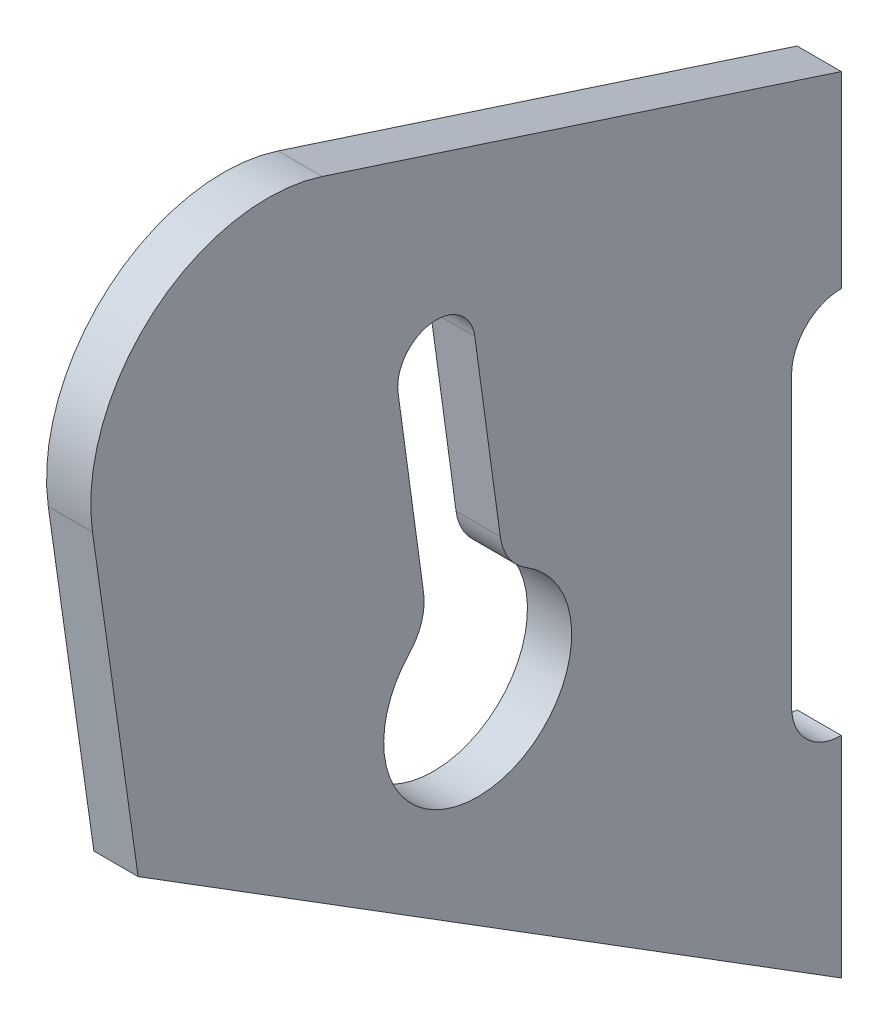
ISO-10303-21;
HEADER;
FILE_DESCRIPTION(('STEP AP214'),'2;1');
FILE_NAME('part.step','',(''),(''),'','','');
FILE_SCHEMA(('AUTOMOTIVE_DESIGN { 1 0 10303 214 1 1 1 1 }'));
ENDSEC;
DATA;
#1=APPLICATION_CONTEXT('core data for automotive mechanical design processes');
#2=APPLICATION_PROTOCOL_DEFINITION('international standard','automotive_design',2000,#1);
#3=PRODUCT_CONTEXT('',#1,'mechanical');
#4=PRODUCT('Part','Part','',(#3));
#5=PRODUCT_RELATED_PRODUCT_CATEGORY('part','',(#4));
#6=PRODUCT_DEFINITION_FORMATION('','',#4);
#7=PRODUCT_DEFINITION_CONTEXT('part definition',#1,'design');
#8=PRODUCT_DEFINITION('design','',#6,#7);
#9=PRODUCT_DEFINITION_SHAPE('','',#8);
#10=(LENGTH_UNIT() NAMED_UNIT(*) SI_UNIT(.MILLI.,.METRE.));
#11=(NAMED_UNIT(*) PLANE_ANGLE_UNIT() SI_UNIT($,.RADIAN.));
#12=(NAMED_UNIT(*) SI_UNIT($,.STERADIAN.) SOLID_ANGLE_UNIT());
#13=UNCERTAINTY_MEASURE_WITH_UNIT(LENGTH_MEASURE(1.E-05),#10,'distance_accuracy_value','');
#14=(GEOMETRIC_REPRESENTATION_CONTEXT(3) GLOBAL_UNCERTAINTY_ASSIGNED_CONTEXT((#13)) GLOBAL_UNIT_ASSIGNED_CONTEXT((#10,
#11,#12)) REPRESENTATION_CONTEXT('',''));
#15=CARTESIAN_POINT('',(0.,0.,0.));
#16=DIRECTION('',(0.,0.,1.));
#17=DIRECTION('',(1.,0.,0.));
#18=AXIS2_PLACEMENT_3D('',#15,#16,#17);
#19=CARTESIAN_POINT('',(4.,99.,0.));
#20=DIRECTION('',(-1.,0.,0.));
#21=DIRECTION('',(0.,0.,1.));
#22=AXIS2_PLACEMENT_3D('',#19,#20,#21);
#23=CYLINDRICAL_SURFACE('',#22,9.);
#24=CARTESIAN_POINT('',(-4.,99.,0.));
#25=DIRECTION('',(1.,0.,0.));
#26=DIRECTION('',(0.,0.,-1.));
#27=AXIS2_PLACEMENT_3D('',#24,#25,#26);
#28=CIRCLE('',#27,9.);
#29=CARTESIAN_POINT('',(-4.,108.,0.));
#30=VERTEX_POINT('',#29);
#31=CARTESIAN_POINT('',(-4.,99.,9.));
#32=VERTEX_POINT('',#31);
#33=EDGE_CURVE('E228',#30,#32,#28,.T.);
#34=ORIENTED_EDGE('',*,*,#33,.F.);
#35=DIRECTION('',(-1.,0.,0.));
#36=VECTOR('',#35,1.);
#37=CARTESIAN_POINT('',(4.,108.,0.));
#38=LINE('',#37,#36);
#39=CARTESIAN_POINT('',(4.,108.,0.));
#40=VERTEX_POINT('',#39);
#41=EDGE_CURVE('E282',#40,#30,#38,.T.);
#42=ORIENTED_EDGE('',*,*,#41,.F.);
#43=CARTESIAN_POINT('',(4.,99.,0.));
#44=DIRECTION('',(1.,0.,0.));
#45=DIRECTION('',(0.,0.,-1.));
#46=AXIS2_PLACEMENT_3D('',#43,#44,#45);
#47=CIRCLE('',#46,9.);
#48=CARTESIAN_POINT('',(4.,99.,9.));
#49=VERTEX_POINT('',#48);
#50=EDGE_CURVE('E190',#40,#49,#47,.T.);
#51=ORIENTED_EDGE('',*,*,#50,.T.);
#52=DIRECTION('',(-1.,0.,0.));
#53=VECTOR('',#52,1.);
#54=CARTESIAN_POINT('',(4.,99.,9.));
#55=LINE('',#54,#53);
#56=EDGE_CURVE('E170',#49,#32,#55,.T.);
#57=ORIENTED_EDGE('',*,*,#56,.T.);
#58=EDGE_LOOP('',(#34,#42,#51,#57));
#59=FACE_BOUND('',#58,.T.);
#60=ADVANCED_FACE('F42',(#59),#23,.F.);
#61=CARTESIAN_POINT('',(4.,0.,0.));
#62=DIRECTION('',(0.,0.,1.));
#63=DIRECTION('',(1.,0.,0.));
#64=AXIS2_PLACEMENT_3D('',#61,#62,#63);
#65=PLANE('',#64);
#66=DIRECTION('',(0.,1.,0.));
#67=VECTOR('',#66,1.);
#68=CARTESIAN_POINT('',(-4.,0.,0.));
#69=LINE('',#68,#67);
#70=CARTESIAN_POINT('',(-4.,142.,0.));
#71=VERTEX_POINT('',#70);
#72=EDGE_CURVE('E234',#30,#71,#69,.T.);
#73=ORIENTED_EDGE('',*,*,#72,.T.);
#74=DIRECTION('',(-1.,0.,0.));
#75=VECTOR('',#74,1.);
#76=CARTESIAN_POINT('',(4.,142.,0.));
#77=LINE('',#76,#75);
#78=CARTESIAN_POINT('',(4.,142.,0.));
#79=VERTEX_POINT('',#78);
#80=EDGE_CURVE('E279',#79,#71,#77,.T.);
#81=ORIENTED_EDGE('',*,*,#80,.F.);
#82=DIRECTION('',(0.,1.,0.));
#83=VECTOR('',#82,1.);
#84=CARTESIAN_POINT('',(4.,0.,0.));
#85=LINE('',#84,#83);
#86=EDGE_CURVE('E193',#40,#79,#85,.T.);
#87=ORIENTED_EDGE('',*,*,#86,.F.);
#88=ORIENTED_EDGE('',*,*,#41,.T.);
#89=EDGE_LOOP('',(#73,#81,#87,#88));
#90=FACE_BOUND('',#89,.T.);
#91=ADVANCED_FACE('F326',(#90),#65,.F.);
#92=CARTESIAN_POINT('',(4.,128.440206600621,-41.7327529127661));
#93=DIRECTION('',(0.,0.951056516295152,-0.309016994374952));
#94=DIRECTION('',(0.,0.309016994374952,0.951056516295152));
#95=AXIS2_PLACEMENT_3D('',#92,#93,#94);
#96=PLANE('',#95);
#97=DIRECTION('',(0.,-0.309016994374951,-0.951056516295152));
#98=VECTOR('',#97,1.);
#99=CARTESIAN_POINT('',(-4.,128.440206600621,-41.7327529127661));
#100=LINE('',#99,#98);
#101=CARTESIAN_POINT('',(-4.,172.503548140476,93.8802679373735));
#102=VERTEX_POINT('',#101);
#103=EDGE_CURVE('E236',#102,#71,#100,.T.);
#104=ORIENTED_EDGE('',*,*,#103,.F.);
#105=DIRECTION('',(-1.,0.,0.));
#106=VECTOR('',#105,1.);
#107=CARTESIAN_POINT('',(4.,172.503548140476,93.8802679373735));
#108=LINE('',#107,#106);
#109=CARTESIAN_POINT('',(4.,172.503548140476,93.8802679373735));
#110=VERTEX_POINT('',#109);
#111=EDGE_CURVE('E274',#110,#102,#108,.T.);
#112=ORIENTED_EDGE('',*,*,#111,.F.);
#113=DIRECTION('',(0.,-0.309016994374951,-0.951056516295152));
#114=VECTOR('',#113,1.);
#115=CARTESIAN_POINT('',(4.,128.440206600621,-41.7327529127661));
#116=LINE('',#115,#114);
#117=EDGE_CURVE('E194',#110,#79,#116,.T.);
#118=ORIENTED_EDGE('',*,*,#117,.T.);
#119=ORIENTED_EDGE('',*,*,#80,.T.);
#120=EDGE_LOOP('',(#104,#112,#118,#119));
#121=FACE_BOUND('',#120,.T.);
#122=ADVANCED_FACE('F335',(#121),#96,.T.);
#123=CARTESIAN_POINT('',(4.,142.069739619031,103.768811757372));
#124=DIRECTION('',(-1.,0.,0.));
#125=DIRECTION('',(0.,0.,1.));
#126=AXIS2_PLACEMENT_3D('',#123,#124,#125);
#127=CYLINDRICAL_SURFACE('',#126,32.);
#128=CARTESIAN_POINT('',(-4.,142.069739619031,103.768811757372));
#129=DIRECTION('',(1.,0.,0.));
#130=DIRECTION('',(0.,0.,-1.));
#131=AXIS2_PLACEMENT_3D('',#128,#129,#130);
#132=CIRCLE('',#131,32.);
#133=CARTESIAN_POINT('',(-4.,137.573015723535,135.451290735629));
#134=VERTEX_POINT('',#133);
#135=EDGE_CURVE('E244',#134,#102,#132,.F.);
#136=ORIENTED_EDGE('',*,*,#135,.F.);
#137=DIRECTION('',(-1.,0.,0.));
#138=VECTOR('',#137,1.);
#139=CARTESIAN_POINT('',(4.,137.573015723535,135.451290735629));
#140=LINE('',#139,#138);
#141=CARTESIAN_POINT('',(4.,137.573015723535,135.451290735629));
#142=VERTEX_POINT('',#141);
#143=EDGE_CURVE('E275',#142,#134,#140,.T.);
#144=ORIENTED_EDGE('',*,*,#143,.F.);
#145=CARTESIAN_POINT('',(4.,142.069739619031,103.768811757372));
#146=DIRECTION('',(1.,0.,0.));
#147=DIRECTION('',(0.,0.,-1.));
#148=AXIS2_PLACEMENT_3D('',#145,#146,#147);
#149=CIRCLE('',#148,32.);
#150=EDGE_CURVE('E200',#142,#110,#149,.F.);
#151=ORIENTED_EDGE('',*,*,#150,.T.);
#152=ORIENTED_EDGE('',*,*,#111,.T.);
#153=EDGE_LOOP('',(#136,#144,#151,#152));
#154=FACE_BOUND('',#153,.T.);
#155=ADVANCED_FACE('F369',(#154),#127,.T.);
#156=CARTESIAN_POINT('',(4.,-16.1285050060768,113.636290037191));
#157=DIRECTION('',(0.,-0.140522621734246,0.990077468070521));
#158=DIRECTION('',(0.,-0.990077468070521,-0.140522621734246));
#159=AXIS2_PLACEMENT_3D('',#156,#157,#158);
#160=PLANE('',#159);
#161=DIRECTION('',(0.,0.990077468070521,0.140522621734246));
#162=VECTOR('',#161,1.);
#163=CARTESIAN_POINT('',(-4.,-16.1285050060768,113.636290037191));
#164=LINE('',#163,#162);
#165=CARTESIAN_POINT('',(-4.,79.4878896349804,127.207214423464));
#166=VERTEX_POINT('',#165);
#167=EDGE_CURVE('E250',#166,#134,#164,.T.);
#168=ORIENTED_EDGE('',*,*,#167,.F.);
#169=DIRECTION('',(-1.,0.,0.));
#170=VECTOR('',#169,1.);
#171=CARTESIAN_POINT('',(4.,79.4878896349804,127.207214423464));
#172=LINE('',#171,#170);
#173=CARTESIAN_POINT('',(4.,79.4878896349804,127.207214423464));
#174=VERTEX_POINT('',#173);
#175=EDGE_CURVE('E267',#174,#166,#172,.T.);
#176=ORIENTED_EDGE('',*,*,#175,.F.);
#177=DIRECTION('',(0.,0.990077468070521,0.140522621734246));
#178=VECTOR('',#177,1.);
#179=CARTESIAN_POINT('',(4.,-16.1285050060768,113.636290037191));
#180=LINE('',#179,#178);
#181=EDGE_CURVE('E201',#174,#142,#180,.T.);
#182=ORIENTED_EDGE('',*,*,#181,.T.);
#183=ORIENTED_EDGE('',*,*,#143,.T.);
#184=EDGE_LOOP('',(#168,#176,#182,#183));
#185=FACE_BOUND('',#184,.T.);
#186=ADVANCED_FACE('F368',(#185),#160,.T.);
#187=CARTESIAN_POINT('',(4.,0.,0.));
#188=DIRECTION('',(0.,-0.848048096156428,0.529919264233202));
#189=DIRECTION('',(0.,-0.529919264233202,-0.848048096156428));
#190=AXIS2_PLACEMENT_3D('',#187,#188,#189);
#191=PLANE('',#190);
#192=DIRECTION('',(0.,0.529919264233202,0.848048096156428));
#193=VECTOR('',#192,1.);
#194=CARTESIAN_POINT('',(-4.,0.,0.));
#195=LINE('',#194,#193);
#196=CARTESIAN_POINT('',(-4.,0.,0.));
#197=VERTEX_POINT('',#196);
#198=EDGE_CURVE('E253',#197,#166,#195,.T.);
#199=ORIENTED_EDGE('',*,*,#198,.F.);
#200=DIRECTION('',(-1.,0.,0.));
#201=VECTOR('',#200,1.);
#202=CARTESIAN_POINT('',(4.,0.,0.));
#203=LINE('',#202,#201);
#204=CARTESIAN_POINT('',(4.,0.,0.));
#205=VERTEX_POINT('',#204);
#206=EDGE_CURVE('E266',#205,#197,#203,.T.);
#207=ORIENTED_EDGE('',*,*,#206,.F.);
#208=DIRECTION('',(0.,0.529919264233202,0.848048096156428));
#209=VECTOR('',#208,1.);
#210=CARTESIAN_POINT('',(4.,0.,0.));
#211=LINE('',#210,#209);
#212=EDGE_CURVE('E210',#205,#174,#211,.T.);
#213=ORIENTED_EDGE('',*,*,#212,.T.);
#214=ORIENTED_EDGE('',*,*,#175,.T.);
#215=EDGE_LOOP('',(#199,#207,#213,#214));
#216=FACE_BOUND('',#215,.T.);
#217=ADVANCED_FACE('F356',(#216),#191,.T.);
#218=CARTESIAN_POINT('',(-4.,38.,0.));
#219=VERTEX_POINT('',#218);
#220=EDGE_CURVE('E239',#197,#219,#69,.T.);
#221=ORIENTED_EDGE('',*,*,#220,.T.);
#222=DIRECTION('',(-1.,0.,0.));
#223=VECTOR('',#222,1.);
#224=CARTESIAN_POINT('',(4.,38.,0.));
#225=LINE('',#224,#223);
#226=CARTESIAN_POINT('',(4.,38.,0.));
#227=VERTEX_POINT('',#226);
#228=EDGE_CURVE('E263',#227,#219,#225,.T.);
#229=ORIENTED_EDGE('',*,*,#228,.F.);
#230=EDGE_CURVE('E192',#205,#227,#85,.T.);
#231=ORIENTED_EDGE('',*,*,#230,.F.);
#232=ORIENTED_EDGE('',*,*,#206,.T.);
#233=EDGE_LOOP('',(#221,#229,#231,#232));
#234=FACE_BOUND('',#233,.T.);
#235=ADVANCED_FACE('F333',(#234),#65,.F.);
#236=CARTESIAN_POINT('',(4.,47.,0.));
#237=DIRECTION('',(-1.,0.,0.));
#238=DIRECTION('',(0.,0.,1.));
#239=AXIS2_PLACEMENT_3D('',#236,#237,#238);
#240=CYLINDRICAL_SURFACE('',#239,9.);
#241=CARTESIAN_POINT('',(-4.,47.,0.));
#242=DIRECTION('',(1.,0.,0.));
#243=DIRECTION('',(0.,0.,-1.));
#244=AXIS2_PLACEMENT_3D('',#241,#242,#243);
#245=CIRCLE('',#244,9.);
#246=CARTESIAN_POINT('',(-4.,47.,9.));
#247=VERTEX_POINT('',#246);
#248=EDGE_CURVE('E177',#247,#219,#245,.T.);
#249=ORIENTED_EDGE('',*,*,#248,.F.);
#250=DIRECTION('',(-1.,0.,0.));
#251=VECTOR('',#250,1.);
#252=CARTESIAN_POINT('',(4.,47.,9.));
#253=LINE('',#252,#251);
#254=CARTESIAN_POINT('',(4.,47.,9.));
#255=VERTEX_POINT('',#254);
#256=EDGE_CURVE('E257',#255,#247,#253,.T.);
#257=ORIENTED_EDGE('',*,*,#256,.F.);
#258=CARTESIAN_POINT('',(4.,47.,0.));
#259=DIRECTION('',(1.,0.,0.));
#260=DIRECTION('',(0.,0.,-1.));
#261=AXIS2_PLACEMENT_3D('',#258,#259,#260);
#262=CIRCLE('',#261,9.);
#263=EDGE_CURVE('E211',#255,#227,#262,.T.);
#264=ORIENTED_EDGE('',*,*,#263,.T.);
#265=ORIENTED_EDGE('',*,*,#228,.T.);
#266=EDGE_LOOP('',(#249,#257,#264,#265));
#267=FACE_BOUND('',#266,.T.);
#268=ADVANCED_FACE('F346',(#267),#240,.F.);
#269=CARTESIAN_POINT('',(4.,132.7354236822,73.2447574240369));
#270=DIRECTION('',(-1.,0.,0.));
#271=DIRECTION('',(0.,0.,1.));
#272=AXIS2_PLACEMENT_3D('',#269,#270,#271);
#273=CYLINDRICAL_SURFACE('',#272,7.00000000000002);
#274=CARTESIAN_POINT('',(-4.,132.7354236822,73.2447574240369));
#275=DIRECTION('',(1.,0.,0.));
#276=DIRECTION('',(0.,0.,-1.));
#277=AXIS2_PLACEMENT_3D('',#274,#275,#276);
#278=CIRCLE('',#277,7.00000000000002);
#279=CARTESIAN_POINT('',(-4.,133.685771579893,66.3095689714171));
#280=VERTEX_POINT('',#279);
#281=CARTESIAN_POINT('',(-4.,131.785075784507,80.1799458766567));
#282=VERTEX_POINT('',#281);
#283=EDGE_CURVE('E164',#280,#282,#278,.T.);
#284=ORIENTED_EDGE('',*,*,#283,.F.);
#285=DIRECTION('',(-1.,0.,0.));
#286=VECTOR('',#285,1.);
#287=CARTESIAN_POINT('',(4.,133.685771579893,66.3095689714171));
#288=LINE('',#287,#286);
#289=CARTESIAN_POINT('',(4.,133.685771579893,66.3095689714171));
#290=VERTEX_POINT('',#289);
#291=EDGE_CURVE('E153',#290,#280,#288,.T.);
#292=ORIENTED_EDGE('',*,*,#291,.F.);
#293=CARTESIAN_POINT('',(4.,132.7354236822,73.2447574240369));
#294=DIRECTION('',(1.,0.,0.));
#295=DIRECTION('',(0.,0.,-1.));
#296=AXIS2_PLACEMENT_3D('',#293,#294,#295);
#297=CIRCLE('',#296,7.00000000000002);
#298=CARTESIAN_POINT('',(4.,131.785075784507,80.1799458766567));
#299=VERTEX_POINT('',#298);
#300=EDGE_CURVE('E158',#290,#299,#297,.T.);
#301=ORIENTED_EDGE('',*,*,#300,.T.);
#302=DIRECTION('',(-1.,0.,0.));
#303=VECTOR('',#302,1.);
#304=CARTESIAN_POINT('',(4.,131.785075784507,80.1799458766567));
#305=LINE('',#304,#303);
#306=EDGE_CURVE('E169',#299,#282,#305,.T.);
#307=ORIENTED_EDGE('',*,*,#306,.T.);
#308=EDGE_LOOP('',(#284,#292,#301,#307));
#309=FACE_BOUND('',#308,.T.);
#310=ADVANCED_FACE('F165',(#309),#273,.F.);
#311=CARTESIAN_POINT('',(4.,-6.45502213446092,47.1056915862058));
#312=DIRECTION('',(0.,-0.135763985384693,0.990741207517112));
#313=DIRECTION('',(0.,-0.990741207517112,-0.135763985384693));
#314=AXIS2_PLACEMENT_3D('',#311,#312,#313);
#315=PLANE('',#314);
#316=DIRECTION('',(0.,0.990741207517112,0.135763985384693));
#317=VECTOR('',#316,1.);
#318=CARTESIAN_POINT('',(-4.,-6.45502213446092,47.1056915862058));
#319=LINE('',#318,#317);
#320=CARTESIAN_POINT('',(-4.,99.9769680602663,61.6903591579452));
#321=VERTEX_POINT('',#320);
#322=EDGE_CURVE('E219',#321,#280,#319,.T.);
#323=ORIENTED_EDGE('',*,*,#322,.F.);
#324=DIRECTION('',(-1.,0.,0.));
#325=VECTOR('',#324,1.);
#326=CARTESIAN_POINT('',(4.,99.9769680602663,61.6903591579452));
#327=LINE('',#326,#325);
#328=CARTESIAN_POINT('',(4.,99.9769680602663,61.6903591579452));
#329=VERTEX_POINT('',#328);
#330=EDGE_CURVE('E11',#321,#329,#327,.F.);
#331=ORIENTED_EDGE('',*,*,#330,.T.);
#332=DIRECTION('',(0.,0.990741207517112,0.135763985384693));
#333=VECTOR('',#332,1.);
#334=CARTESIAN_POINT('',(4.,-6.45502213446092,47.1056915862058));
#335=LINE('',#334,#333);
#336=EDGE_CURVE('E147',#329,#290,#335,.T.);
#337=ORIENTED_EDGE('',*,*,#336,.T.);
#338=ORIENTED_EDGE('',*,*,#291,.T.);
#339=EDGE_LOOP('',(#323,#331,#337,#338));
#340=FACE_BOUND('',#339,.T.);
#341=ADVANCED_FACE('F155',(#340),#315,.T.);
#342=CARTESIAN_POINT('',(4.,78.244657268759,65.7777382278788));
#343=DIRECTION('',(-1.,0.,0.));
#344=DIRECTION('',(0.,0.,1.));
#345=AXIS2_PLACEMENT_3D('',#342,#343,#344);
#346=CYLINDRICAL_SURFACE('',#345,17.);
#347=CARTESIAN_POINT('',(-4.,78.244657268759,65.7777382278788));
#348=DIRECTION('',(1.,0.,0.));
#349=DIRECTION('',(0.,0.,-1.));
#350=AXIS2_PLACEMENT_3D('',#347,#348,#349);
#351=CIRCLE('',#350,17.);
#352=CARTESIAN_POINT('',(-4.,89.8764193953764,78.175403727068));
#353=VERTEX_POINT('',#352);
#354=CARTESIAN_POINT('',(-4.,92.7827743417598,56.9662030624424));
#355=VERTEX_POINT('',#354);
#356=EDGE_CURVE('E224',#353,#355,#351,.T.);
#357=ORIENTED_EDGE('',*,*,#356,.F.);
#358=DIRECTION('',(-1.,0.,0.));
#359=VECTOR('',#358,1.);
#360=CARTESIAN_POINT('',(4.,89.8764193953764,78.175403727068));
#361=LINE('',#360,#359);
#362=CARTESIAN_POINT('',(4.,89.8764193953764,78.175403727068));
#363=VERTEX_POINT('',#362);
#364=EDGE_CURVE('E298',#353,#363,#361,.F.);
#365=ORIENTED_EDGE('',*,*,#364,.T.);
#366=CARTESIAN_POINT('',(4.,78.244657268759,65.7777382278788));
#367=DIRECTION('',(1.,0.,0.));
#368=DIRECTION('',(0.,0.,-1.));
#369=AXIS2_PLACEMENT_3D('',#366,#367,#368);
#370=CIRCLE('',#369,17.);
#371=CARTESIAN_POINT('',(4.,92.7827743417598,56.9662030624424));
#372=VERTEX_POINT('',#371);
#373=EDGE_CURVE('E160',#363,#372,#370,.T.);
#374=ORIENTED_EDGE('',*,*,#373,.T.);
#375=DIRECTION('',(-1.,0.,0.));
#376=VECTOR('',#375,1.);
#377=CARTESIAN_POINT('',(4.,92.7827743417598,56.9662030624424));
#378=LINE('',#377,#376);
#379=EDGE_CURVE('E297',#372,#355,#378,.T.);
#380=ORIENTED_EDGE('',*,*,#379,.T.);
#381=EDGE_LOOP('',(#357,#365,#374,#380));
#382=FACE_BOUND('',#381,.T.);
#383=ADVANCED_FACE('F318',(#382),#346,.F.);
#384=CARTESIAN_POINT('',(4.,-8.35571792984663,60.9760684914453));
#385=DIRECTION('',(0.,-0.135763985384693,0.990741207517112));
#386=DIRECTION('',(0.,-0.990741207517112,-0.135763985384693));
#387=AXIS2_PLACEMENT_3D('',#384,#385,#386);
#388=PLANE('',#387);
#389=DIRECTION('',(0.,0.990741207517112,0.135763985384693));
#390=VECTOR('',#389,1.);
#391=CARTESIAN_POINT('',(4.,-8.35571792984663,60.9760684914453));
#392=LINE('',#391,#390);
#393=CARTESIAN_POINT('',(4.,98.0762722648807,75.5607360631847));
#394=VERTEX_POINT('',#393);
#395=EDGE_CURVE('E174',#394,#299,#392,.T.);
#396=ORIENTED_EDGE('',*,*,#395,.F.);
#397=DIRECTION('',(1.,0.,0.));
#398=VECTOR('',#397,1.);
#399=CARTESIAN_POINT('',(-4.,98.0762722648807,75.5607360631847));
#400=LINE('',#399,#398);
#401=CARTESIAN_POINT('',(-4.,98.0762722648807,75.5607360631847));
#402=VERTEX_POINT('',#401);
#403=EDGE_CURVE('E281',#394,#402,#400,.F.);
#404=ORIENTED_EDGE('',*,*,#403,.T.);
#405=DIRECTION('',(0.,0.990741207517112,0.135763985384693));
#406=VECTOR('',#405,1.);
#407=CARTESIAN_POINT('',(-4.,-8.35571792984663,60.9760684914453));
#408=LINE('',#407,#406);
#409=EDGE_CURVE('E230',#402,#282,#408,.T.);
#410=ORIENTED_EDGE('',*,*,#409,.T.);
#411=ORIENTED_EDGE('',*,*,#306,.F.);
#412=EDGE_LOOP('',(#396,#404,#410,#411));
#413=FACE_BOUND('',#412,.T.);
#414=ADVANCED_FACE('F309',(#413),#388,.F.);
#415=CARTESIAN_POINT('',(4.,0.,9.));
#416=DIRECTION('',(0.,0.,1.));
#417=DIRECTION('',(1.,0.,0.));
#418=AXIS2_PLACEMENT_3D('',#415,#416,#417);
#419=PLANE('',#418);
#420=DIRECTION('',(0.,1.,0.));
#421=VECTOR('',#420,1.);
#422=CARTESIAN_POINT('',(-4.,0.,9.));
#423=LINE('',#422,#421);
#424=EDGE_CURVE('E178',#247,#32,#423,.T.);
#425=ORIENTED_EDGE('',*,*,#424,.T.);
#426=ORIENTED_EDGE('',*,*,#56,.F.);
#427=DIRECTION('',(0.,1.,0.));
#428=VECTOR('',#427,1.);
#429=CARTESIAN_POINT('',(4.,0.,9.));
#430=LINE('',#429,#428);
#431=EDGE_CURVE('E214',#255,#49,#430,.T.);
#432=ORIENTED_EDGE('',*,*,#431,.F.);
#433=ORIENTED_EDGE('',*,*,#256,.T.);
#434=EDGE_LOOP('',(#425,#426,#432,#433));
#435=FACE_BOUND('',#434,.T.);
#436=ADVANCED_FACE('F345',(#435),#419,.F.);
#437=CARTESIAN_POINT('',(4.,0.,0.));
#438=DIRECTION('',(1.,0.,0.));
#439=DIRECTION('',(0.,0.,-1.));
#440=AXIS2_PLACEMENT_3D('',#437,#438,#439);
#441=PLANE('',#440);
#442=ORIENTED_EDGE('',*,*,#373,.F.);
#443=CARTESIAN_POINT('',(4.,96.7186324110337,85.4681481383559));
#444=DIRECTION('',(1.,0.,0.));
#445=DIRECTION('',(0.,0.,-1.));
#446=AXIS2_PLACEMENT_3D('',#443,#444,#445);
#447=CIRCLE('',#446,10.);
#448=EDGE_CURVE('E52',#363,#394,#447,.T.);
#449=ORIENTED_EDGE('',*,*,#448,.T.);
#450=ORIENTED_EDGE('',*,*,#395,.T.);
#451=ORIENTED_EDGE('',*,*,#300,.F.);
#452=ORIENTED_EDGE('',*,*,#336,.F.);
#453=CARTESIAN_POINT('',(4.,101.334607914113,51.782947082774));
#454=DIRECTION('',(1.,0.,0.));
#455=DIRECTION('',(0.,0.,-1.));
#456=AXIS2_PLACEMENT_3D('',#453,#454,#455);
#457=CIRCLE('',#456,10.);
#458=EDGE_CURVE('E63',#329,#372,#457,.T.);
#459=ORIENTED_EDGE('',*,*,#458,.T.);
#460=EDGE_LOOP('',(#442,#449,#450,#451,#452,#459));
#461=FACE_BOUND('',#460,.T.);
#462=ORIENTED_EDGE('',*,*,#50,.F.);
#463=ORIENTED_EDGE('',*,*,#86,.T.);
#464=ORIENTED_EDGE('',*,*,#117,.F.);
#465=ORIENTED_EDGE('',*,*,#150,.F.);
#466=ORIENTED_EDGE('',*,*,#181,.F.);
#467=ORIENTED_EDGE('',*,*,#212,.F.);
#468=ORIENTED_EDGE('',*,*,#230,.T.);
#469=ORIENTED_EDGE('',*,*,#263,.F.);
#470=ORIENTED_EDGE('',*,*,#431,.T.);
#471=EDGE_LOOP('',(#462,#463,#464,#465,#466,#467,#468,#469,#470));
#472=FACE_BOUND('',#471,.T.);
#473=ADVANCED_FACE('F168',(#461,#472),#441,.T.);
#474=CARTESIAN_POINT('',(-4.,0.,0.));
#475=DIRECTION('',(1.,0.,0.));
#476=DIRECTION('',(0.,0.,-1.));
#477=AXIS2_PLACEMENT_3D('',#474,#475,#476);
#478=PLANE('',#477);
#479=ORIENTED_EDGE('',*,*,#409,.F.);
#480=CARTESIAN_POINT('',(-4.,96.7186324110337,85.4681481383559));
#481=DIRECTION('',(1.,0.,0.));
#482=DIRECTION('',(0.,0.,-1.));
#483=AXIS2_PLACEMENT_3D('',#480,#481,#482);
#484=CIRCLE('',#483,10.);
#485=EDGE_CURVE('E291',#402,#353,#484,.F.);
#486=ORIENTED_EDGE('',*,*,#485,.T.);
#487=ORIENTED_EDGE('',*,*,#356,.T.);
#488=CARTESIAN_POINT('',(-4.,101.334607914113,51.782947082774));
#489=DIRECTION('',(1.,0.,0.));
#490=DIRECTION('',(0.,0.,-1.));
#491=AXIS2_PLACEMENT_3D('',#488,#489,#490);
#492=CIRCLE('',#491,10.);
#493=EDGE_CURVE('E287',#355,#321,#492,.F.);
#494=ORIENTED_EDGE('',*,*,#493,.T.);
#495=ORIENTED_EDGE('',*,*,#322,.T.);
#496=ORIENTED_EDGE('',*,*,#283,.T.);
#497=EDGE_LOOP('',(#479,#486,#487,#494,#495,#496));
#498=FACE_BOUND('',#497,.T.);
#499=ORIENTED_EDGE('',*,*,#33,.T.);
#500=ORIENTED_EDGE('',*,*,#424,.F.);
#501=ORIENTED_EDGE('',*,*,#248,.T.);
#502=ORIENTED_EDGE('',*,*,#220,.F.);
#503=ORIENTED_EDGE('',*,*,#198,.T.);
#504=ORIENTED_EDGE('',*,*,#167,.T.);
#505=ORIENTED_EDGE('',*,*,#135,.T.);
#506=ORIENTED_EDGE('',*,*,#103,.T.);
#507=ORIENTED_EDGE('',*,*,#72,.F.);
#508=EDGE_LOOP('',(#499,#500,#501,#502,#503,#504,#505,#506,#507));
#509=FACE_BOUND('',#508,.T.);
#510=ADVANCED_FACE('F312',(#498,#509),#478,.F.);
#511=CARTESIAN_POINT('',(4.,96.7186324110337,85.4681481383559));
#512=DIRECTION('',(-1.,0.,0.));
#513=DIRECTION('',(0.,0.,1.));
#514=AXIS2_PLACEMENT_3D('',#511,#512,#513);
#515=CYLINDRICAL_SURFACE('',#514,10.);
#516=ORIENTED_EDGE('',*,*,#448,.F.);
#517=ORIENTED_EDGE('',*,*,#364,.F.);
#518=ORIENTED_EDGE('',*,*,#485,.F.);
#519=ORIENTED_EDGE('',*,*,#403,.F.);
#520=EDGE_LOOP('',(#516,#517,#518,#519));
#521=FACE_BOUND('',#520,.T.);
#522=ADVANCED_FACE('F315',(#521),#515,.T.);
#523=CARTESIAN_POINT('',(4.,101.334607914113,51.782947082774));
#524=DIRECTION('',(-1.,0.,0.));
#525=DIRECTION('',(0.,0.,1.));
#526=AXIS2_PLACEMENT_3D('',#523,#524,#525);
#527=CYLINDRICAL_SURFACE('',#526,10.);
#528=ORIENTED_EDGE('',*,*,#458,.F.);
#529=ORIENTED_EDGE('',*,*,#330,.F.);
#530=ORIENTED_EDGE('',*,*,#493,.F.);
#531=ORIENTED_EDGE('',*,*,#379,.F.);
#532=EDGE_LOOP('',(#528,#529,#530,#531));
#533=FACE_BOUND('',#532,.T.);
#534=ADVANCED_FACE('F46',(#533),#527,.T.);
#535=CLOSED_SHELL('',(#60,#91,#122,#155,#186,#217,#235,#268,#310,#341,#383,#414,#436,#473,#510,
#522,#534));
#536=MANIFOLD_SOLID_BREP('B2',#535);
#537=ADVANCED_BREP_SHAPE_REPRESENTATION('',(#18,#536),#14);
#538=SHAPE_DEFINITION_REPRESENTATION(#9,#537);
ENDSEC;
END-ISO-10303-21;
